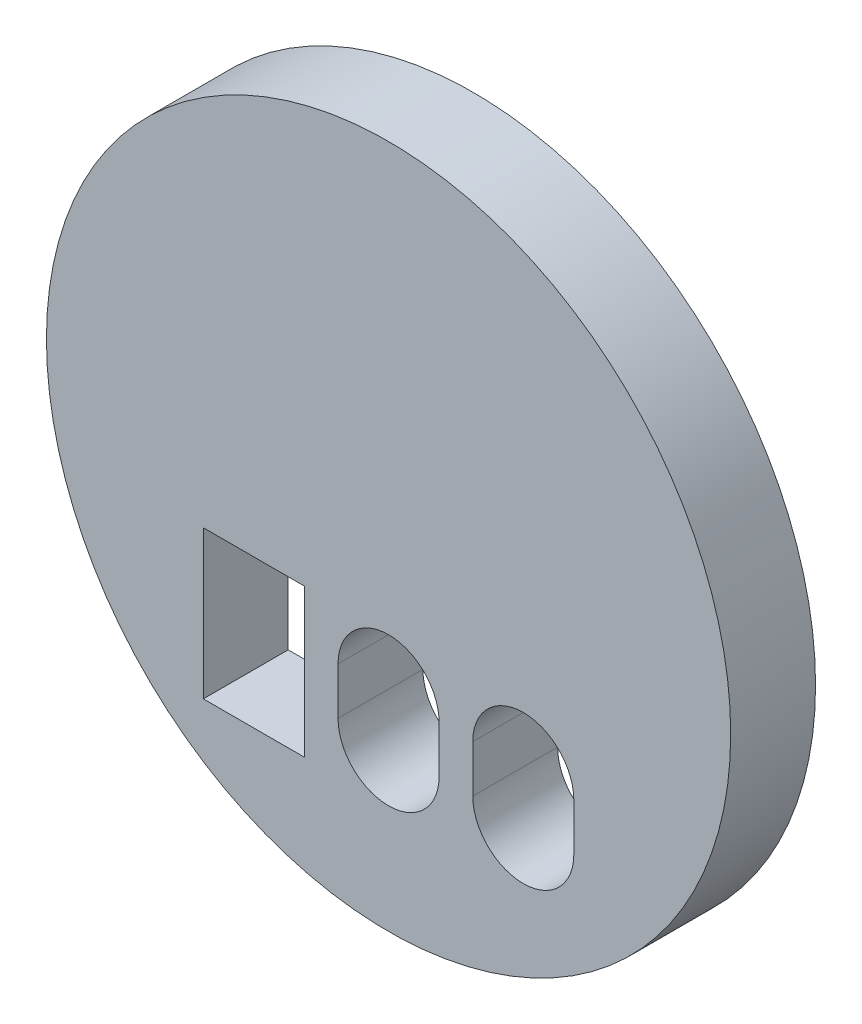
ISO-10303-21;
HEADER;
FILE_DESCRIPTION(('STEP AP214'),'2;1');
FILE_NAME('part.step','',(''),(''),'','','');
FILE_SCHEMA(('AUTOMOTIVE_DESIGN { 1 0 10303 214 1 1 1 1 }'));
ENDSEC;
DATA;
#1=APPLICATION_CONTEXT('core data for automotive mechanical design processes');
#2=APPLICATION_PROTOCOL_DEFINITION('international standard','automotive_design',2000,#1);
#3=PRODUCT_CONTEXT('',#1,'mechanical');
#4=PRODUCT('Part','Part','',(#3));
#5=PRODUCT_RELATED_PRODUCT_CATEGORY('part','',(#4));
#6=PRODUCT_DEFINITION_FORMATION('','',#4);
#7=PRODUCT_DEFINITION_CONTEXT('part definition',#1,'design');
#8=PRODUCT_DEFINITION('design','',#6,#7);
#9=PRODUCT_DEFINITION_SHAPE('','',#8);
#10=(LENGTH_UNIT() NAMED_UNIT(*) SI_UNIT(.MILLI.,.METRE.));
#11=(NAMED_UNIT(*) PLANE_ANGLE_UNIT() SI_UNIT($,.RADIAN.));
#12=(NAMED_UNIT(*) SI_UNIT($,.STERADIAN.) SOLID_ANGLE_UNIT());
#13=UNCERTAINTY_MEASURE_WITH_UNIT(LENGTH_MEASURE(1.E-05),#10,'distance_accuracy_value','');
#14=(GEOMETRIC_REPRESENTATION_CONTEXT(3) GLOBAL_UNCERTAINTY_ASSIGNED_CONTEXT((#13)) GLOBAL_UNIT_ASSIGNED_CONTEXT((#10,
#11,#12)) REPRESENTATION_CONTEXT('',''));
#15=CARTESIAN_POINT('',(0.,0.,0.));
#16=DIRECTION('',(0.,0.,1.));
#17=DIRECTION('',(1.,0.,0.));
#18=AXIS2_PLACEMENT_3D('',#15,#16,#17);
#19=CARTESIAN_POINT('',(0.,0.,1.6));
#20=DIRECTION('',(0.,0.,1.));
#21=DIRECTION('',(1.,0.,0.));
#22=AXIS2_PLACEMENT_3D('',#19,#20,#21);
#23=PLANE('',#22);
#24=CARTESIAN_POINT('',(0.,0.,1.6));
#25=DIRECTION('',(0.,0.,1.));
#26=DIRECTION('',(1.,0.,0.));
#27=AXIS2_PLACEMENT_3D('',#24,#25,#26);
#28=CIRCLE('',#27,6.45);
#29=CARTESIAN_POINT('',(6.45,0.,1.6));
#30=VERTEX_POINT('',#29);
#31=EDGE_CURVE('E11',#30,#30,#28,.T.);
#32=ORIENTED_EDGE('',*,*,#31,.T.);
#33=EDGE_LOOP('',(#32));
#34=FACE_BOUND('',#33,.T.);
#35=DIRECTION('',(0.,1.,0.));
#36=VECTOR('',#35,1.);
#37=CARTESIAN_POINT('',(0.9525,-2.5555,1.6));
#38=LINE('',#37,#36);
#39=CARTESIAN_POINT('',(0.9525,-3.4445,1.6));
#40=VERTEX_POINT('',#39);
#41=CARTESIAN_POINT('',(0.9525,-2.5555,1.6));
#42=VERTEX_POINT('',#41);
#43=EDGE_CURVE('E190',#40,#42,#38,.T.);
#44=ORIENTED_EDGE('',*,*,#43,.F.);
#45=CARTESIAN_POINT('',(0.,-3.4445,1.6));
#46=DIRECTION('',(0.,0.,1.));
#47=DIRECTION('',(1.,0.,0.));
#48=AXIS2_PLACEMENT_3D('',#45,#46,#47);
#49=CIRCLE('',#48,0.9525);
#50=CARTESIAN_POINT('',(-0.9525,-3.4445,1.6));
#51=VERTEX_POINT('',#50);
#52=EDGE_CURVE('E188',#51,#40,#49,.T.);
#53=ORIENTED_EDGE('',*,*,#52,.F.);
#54=DIRECTION('',(0.,-1.,0.));
#55=VECTOR('',#54,1.);
#56=CARTESIAN_POINT('',(-0.9525,-3.4445,1.6));
#57=LINE('',#56,#55);
#58=CARTESIAN_POINT('',(-0.9525,-2.5555,1.6));
#59=VERTEX_POINT('',#58);
#60=EDGE_CURVE('E196',#59,#51,#57,.T.);
#61=ORIENTED_EDGE('',*,*,#60,.F.);
#62=CARTESIAN_POINT('',(0.,-2.5555,1.6));
#63=DIRECTION('',(0.,0.,1.));
#64=DIRECTION('',(1.,0.,0.));
#65=AXIS2_PLACEMENT_3D('',#62,#63,#64);
#66=CIRCLE('',#65,0.9525);
#67=EDGE_CURVE('E193',#42,#59,#66,.T.);
#68=ORIENTED_EDGE('',*,*,#67,.F.);
#69=EDGE_LOOP('',(#44,#53,#61,#68));
#70=FACE_BOUND('',#69,.T.);
#71=DIRECTION('',(0.,1.,0.));
#72=VECTOR('',#71,1.);
#73=CARTESIAN_POINT('',(3.4925,-2.5555,1.6));
#74=LINE('',#73,#72);
#75=CARTESIAN_POINT('',(3.4925,-3.4445,1.6));
#76=VERTEX_POINT('',#75);
#77=CARTESIAN_POINT('',(3.4925,-2.5555,1.6));
#78=VERTEX_POINT('',#77);
#79=EDGE_CURVE('E159',#76,#78,#74,.T.);
#80=ORIENTED_EDGE('',*,*,#79,.F.);
#81=CARTESIAN_POINT('',(2.54,-3.4445,1.6));
#82=DIRECTION('',(0.,0.,1.));
#83=DIRECTION('',(1.,0.,0.));
#84=AXIS2_PLACEMENT_3D('',#81,#82,#83);
#85=CIRCLE('',#84,0.9525);
#86=CARTESIAN_POINT('',(1.5875,-3.4445,1.6));
#87=VERTEX_POINT('',#86);
#88=EDGE_CURVE('E157',#87,#76,#85,.T.);
#89=ORIENTED_EDGE('',*,*,#88,.F.);
#90=DIRECTION('',(0.,-1.,0.));
#91=VECTOR('',#90,1.);
#92=CARTESIAN_POINT('',(1.5875,-3.4445,1.6));
#93=LINE('',#92,#91);
#94=CARTESIAN_POINT('',(1.5875,-2.5555,1.6));
#95=VERTEX_POINT('',#94);
#96=EDGE_CURVE('E165',#95,#87,#93,.T.);
#97=ORIENTED_EDGE('',*,*,#96,.F.);
#98=CARTESIAN_POINT('',(2.54,-2.5555,1.6));
#99=DIRECTION('',(0.,0.,1.));
#100=DIRECTION('',(1.,0.,0.));
#101=AXIS2_PLACEMENT_3D('',#98,#99,#100);
#102=CIRCLE('',#101,0.9525);
#103=EDGE_CURVE('E162',#78,#95,#102,.T.);
#104=ORIENTED_EDGE('',*,*,#103,.F.);
#105=EDGE_LOOP('',(#80,#89,#97,#104));
#106=FACE_BOUND('',#105,.T.);
#107=DIRECTION('',(0.,1.,0.));
#108=VECTOR('',#107,1.);
#109=CARTESIAN_POINT('',(-1.5875,-1.603,1.6));
#110=LINE('',#109,#108);
#111=CARTESIAN_POINT('',(-1.5875,-4.397,1.6));
#112=VERTEX_POINT('',#111);
#113=CARTESIAN_POINT('',(-1.5875,-1.603,1.6));
#114=VERTEX_POINT('',#113);
#115=EDGE_CURVE('E129',#112,#114,#110,.T.);
#116=ORIENTED_EDGE('',*,*,#115,.F.);
#117=DIRECTION('',(1.,0.,0.));
#118=VECTOR('',#117,1.);
#119=CARTESIAN_POINT('',(-1.5875,-4.397,1.6));
#120=LINE('',#119,#118);
#121=CARTESIAN_POINT('',(-3.4925,-4.397,1.6));
#122=VERTEX_POINT('',#121);
#123=EDGE_CURVE('E121',#122,#112,#120,.T.);
#124=ORIENTED_EDGE('',*,*,#123,.F.);
#125=DIRECTION('',(0.,-1.,0.));
#126=VECTOR('',#125,1.);
#127=CARTESIAN_POINT('',(-3.4925,-4.397,1.6));
#128=LINE('',#127,#126);
#129=CARTESIAN_POINT('',(-3.4925,-1.603,1.6));
#130=VERTEX_POINT('',#129);
#131=EDGE_CURVE('E143',#130,#122,#128,.T.);
#132=ORIENTED_EDGE('',*,*,#131,.F.);
#133=DIRECTION('',(-1.,0.,0.));
#134=VECTOR('',#133,1.);
#135=CARTESIAN_POINT('',(-3.4925,-1.603,1.6));
#136=LINE('',#135,#134);
#137=EDGE_CURVE('E141',#114,#130,#136,.T.);
#138=ORIENTED_EDGE('',*,*,#137,.F.);
#139=EDGE_LOOP('',(#116,#124,#132,#138));
#140=FACE_BOUND('',#139,.T.);
#141=ADVANCED_FACE('F32',(#34,#70,#106,#140),#23,.T.);
#142=CARTESIAN_POINT('',(0.,0.,0.));
#143=DIRECTION('',(0.,0.,1.));
#144=DIRECTION('',(1.,0.,0.));
#145=AXIS2_PLACEMENT_3D('',#142,#143,#144);
#146=PLANE('',#145);
#147=CARTESIAN_POINT('',(2.54,-3.4445,0.));
#148=DIRECTION('',(0.,0.,1.));
#149=DIRECTION('',(1.,0.,0.));
#150=AXIS2_PLACEMENT_3D('',#147,#148,#149);
#151=CIRCLE('',#150,0.9525);
#152=CARTESIAN_POINT('',(1.5875,-3.4445,0.));
#153=VERTEX_POINT('',#152);
#154=CARTESIAN_POINT('',(3.4925,-3.4445,0.));
#155=VERTEX_POINT('',#154);
#156=EDGE_CURVE('E137',#153,#155,#151,.T.);
#157=ORIENTED_EDGE('',*,*,#156,.T.);
#158=DIRECTION('',(0.,1.,0.));
#159=VECTOR('',#158,1.);
#160=CARTESIAN_POINT('',(3.4925,-2.5555,0.));
#161=LINE('',#160,#159);
#162=CARTESIAN_POINT('',(3.4925,-2.5555,0.));
#163=VERTEX_POINT('',#162);
#164=EDGE_CURVE('E170',#155,#163,#161,.T.);
#165=ORIENTED_EDGE('',*,*,#164,.T.);
#166=CARTESIAN_POINT('',(2.54,-2.5555,0.));
#167=DIRECTION('',(0.,0.,1.));
#168=DIRECTION('',(1.,0.,0.));
#169=AXIS2_PLACEMENT_3D('',#166,#167,#168);
#170=CIRCLE('',#169,0.9525);
#171=CARTESIAN_POINT('',(1.5875,-2.5555,0.));
#172=VERTEX_POINT('',#171);
#173=EDGE_CURVE('E173',#163,#172,#170,.T.);
#174=ORIENTED_EDGE('',*,*,#173,.T.);
#175=DIRECTION('',(0.,-1.,0.));
#176=VECTOR('',#175,1.);
#177=CARTESIAN_POINT('',(1.5875,-3.4445,0.));
#178=LINE('',#177,#176);
#179=EDGE_CURVE('E160',#172,#153,#178,.T.);
#180=ORIENTED_EDGE('',*,*,#179,.T.);
#181=EDGE_LOOP('',(#157,#165,#174,#180));
#182=FACE_BOUND('',#181,.T.);
#183=CARTESIAN_POINT('',(0.,0.,0.));
#184=DIRECTION('',(0.,0.,1.));
#185=DIRECTION('',(1.,0.,0.));
#186=AXIS2_PLACEMENT_3D('',#183,#184,#185);
#187=CIRCLE('',#186,6.45);
#188=CARTESIAN_POINT('',(6.45,0.,0.));
#189=VERTEX_POINT('',#188);
#190=EDGE_CURVE('E36',#189,#189,#187,.T.);
#191=ORIENTED_EDGE('',*,*,#190,.F.);
#192=EDGE_LOOP('',(#191));
#193=FACE_BOUND('',#192,.T.);
#194=CARTESIAN_POINT('',(0.,-3.4445,0.));
#195=DIRECTION('',(0.,0.,1.));
#196=DIRECTION('',(1.,0.,0.));
#197=AXIS2_PLACEMENT_3D('',#194,#195,#196);
#198=CIRCLE('',#197,0.9525);
#199=CARTESIAN_POINT('',(-0.9525,-3.4445,0.));
#200=VERTEX_POINT('',#199);
#201=CARTESIAN_POINT('',(0.9525,-3.4445,0.));
#202=VERTEX_POINT('',#201);
#203=EDGE_CURVE('E187',#200,#202,#198,.T.);
#204=ORIENTED_EDGE('',*,*,#203,.T.);
#205=DIRECTION('',(0.,1.,0.));
#206=VECTOR('',#205,1.);
#207=CARTESIAN_POINT('',(0.9525,-2.5555,0.));
#208=LINE('',#207,#206);
#209=CARTESIAN_POINT('',(0.9525,-2.5555,0.));
#210=VERTEX_POINT('',#209);
#211=EDGE_CURVE('E201',#202,#210,#208,.T.);
#212=ORIENTED_EDGE('',*,*,#211,.T.);
#213=CARTESIAN_POINT('',(0.,-2.5555,0.));
#214=DIRECTION('',(0.,0.,1.));
#215=DIRECTION('',(1.,0.,0.));
#216=AXIS2_PLACEMENT_3D('',#213,#214,#215);
#217=CIRCLE('',#216,0.9525);
#218=CARTESIAN_POINT('',(-0.9525,-2.5555,0.));
#219=VERTEX_POINT('',#218);
#220=EDGE_CURVE('E204',#210,#219,#217,.T.);
#221=ORIENTED_EDGE('',*,*,#220,.T.);
#222=DIRECTION('',(0.,-1.,0.));
#223=VECTOR('',#222,1.);
#224=CARTESIAN_POINT('',(-0.9525,-3.4445,0.));
#225=LINE('',#224,#223);
#226=EDGE_CURVE('E191',#219,#200,#225,.T.);
#227=ORIENTED_EDGE('',*,*,#226,.T.);
#228=EDGE_LOOP('',(#204,#212,#221,#227));
#229=FACE_BOUND('',#228,.T.);
#230=DIRECTION('',(1.,0.,0.));
#231=VECTOR('',#230,1.);
#232=CARTESIAN_POINT('',(-1.5875,-4.397,0.));
#233=LINE('',#232,#231);
#234=CARTESIAN_POINT('',(-3.4925,-4.397,0.));
#235=VERTEX_POINT('',#234);
#236=CARTESIAN_POINT('',(-1.5875,-4.397,0.));
#237=VERTEX_POINT('',#236);
#238=EDGE_CURVE('E55',#235,#237,#233,.T.);
#239=ORIENTED_EDGE('',*,*,#238,.T.);
#240=DIRECTION('',(0.,1.,0.));
#241=VECTOR('',#240,1.);
#242=CARTESIAN_POINT('',(-1.5875,-1.603,0.));
#243=LINE('',#242,#241);
#244=CARTESIAN_POINT('',(-1.5875,-1.603,0.));
#245=VERTEX_POINT('',#244);
#246=EDGE_CURVE('E136',#237,#245,#243,.T.);
#247=ORIENTED_EDGE('',*,*,#246,.T.);
#248=DIRECTION('',(-1.,0.,0.));
#249=VECTOR('',#248,1.);
#250=CARTESIAN_POINT('',(-3.4925,-1.603,0.));
#251=LINE('',#250,#249);
#252=CARTESIAN_POINT('',(-3.4925,-1.603,0.));
#253=VERTEX_POINT('',#252);
#254=EDGE_CURVE('E149',#245,#253,#251,.T.);
#255=ORIENTED_EDGE('',*,*,#254,.T.);
#256=DIRECTION('',(0.,-1.,0.));
#257=VECTOR('',#256,1.);
#258=CARTESIAN_POINT('',(-3.4925,-4.397,0.));
#259=LINE('',#258,#257);
#260=EDGE_CURVE('E130',#253,#235,#259,.T.);
#261=ORIENTED_EDGE('',*,*,#260,.T.);
#262=EDGE_LOOP('',(#239,#247,#255,#261));
#263=FACE_BOUND('',#262,.T.);
#264=ADVANCED_FACE('F223',(#182,#193,#229,#263),#146,.F.);
#265=CARTESIAN_POINT('',(0.,0.,1.6));
#266=DIRECTION('',(0.,0.,-1.));
#267=DIRECTION('',(-1.,0.,0.));
#268=AXIS2_PLACEMENT_3D('',#265,#266,#267);
#269=CYLINDRICAL_SURFACE('',#268,6.45);
#270=ORIENTED_EDGE('',*,*,#31,.F.);
#271=EDGE_LOOP('',(#270));
#272=FACE_BOUND('',#271,.T.);
#273=ORIENTED_EDGE('',*,*,#190,.T.);
#274=EDGE_LOOP('',(#273));
#275=FACE_BOUND('',#274,.T.);
#276=ADVANCED_FACE('F34',(#272,#275),#269,.T.);
#277=CARTESIAN_POINT('',(0.,-3.4445,1.6));
#278=DIRECTION('',(0.,0.,-1.));
#279=DIRECTION('',(-1.,0.,0.));
#280=AXIS2_PLACEMENT_3D('',#277,#278,#279);
#281=CYLINDRICAL_SURFACE('',#280,0.9525);
#282=ORIENTED_EDGE('',*,*,#203,.F.);
#283=DIRECTION('',(0.,0.,-1.));
#284=VECTOR('',#283,1.);
#285=CARTESIAN_POINT('',(-0.9525,-3.4445,1.6));
#286=LINE('',#285,#284);
#287=EDGE_CURVE('E198',#51,#200,#286,.T.);
#288=ORIENTED_EDGE('',*,*,#287,.F.);
#289=ORIENTED_EDGE('',*,*,#52,.T.);
#290=DIRECTION('',(0.,0.,-1.));
#291=VECTOR('',#290,1.);
#292=CARTESIAN_POINT('',(0.9525,-3.4445,1.6));
#293=LINE('',#292,#291);
#294=EDGE_CURVE('E215',#40,#202,#293,.T.);
#295=ORIENTED_EDGE('',*,*,#294,.T.);
#296=EDGE_LOOP('',(#282,#288,#289,#295));
#297=FACE_BOUND('',#296,.T.);
#298=ADVANCED_FACE('F245',(#297),#281,.F.);
#299=CARTESIAN_POINT('',(0.9525,-2.5555,1.6));
#300=DIRECTION('',(-1.,0.,0.));
#301=DIRECTION('',(0.,0.,1.));
#302=AXIS2_PLACEMENT_3D('',#299,#300,#301);
#303=PLANE('',#302);
#304=ORIENTED_EDGE('',*,*,#211,.F.);
#305=ORIENTED_EDGE('',*,*,#294,.F.);
#306=ORIENTED_EDGE('',*,*,#43,.T.);
#307=DIRECTION('',(0.,0.,-1.));
#308=VECTOR('',#307,1.);
#309=CARTESIAN_POINT('',(0.9525,-2.5555,1.6));
#310=LINE('',#309,#308);
#311=EDGE_CURVE('E213',#42,#210,#310,.T.);
#312=ORIENTED_EDGE('',*,*,#311,.T.);
#313=EDGE_LOOP('',(#304,#305,#306,#312));
#314=FACE_BOUND('',#313,.T.);
#315=ADVANCED_FACE('F248',(#314),#303,.T.);
#316=CARTESIAN_POINT('',(0.,-2.5555,1.6));
#317=DIRECTION('',(0.,0.,-1.));
#318=DIRECTION('',(-1.,0.,0.));
#319=AXIS2_PLACEMENT_3D('',#316,#317,#318);
#320=CYLINDRICAL_SURFACE('',#319,0.9525);
#321=ORIENTED_EDGE('',*,*,#220,.F.);
#322=ORIENTED_EDGE('',*,*,#311,.F.);
#323=ORIENTED_EDGE('',*,*,#67,.T.);
#324=DIRECTION('',(0.,0.,-1.));
#325=VECTOR('',#324,1.);
#326=CARTESIAN_POINT('',(-0.9525,-2.5555,1.6));
#327=LINE('',#326,#325);
#328=EDGE_CURVE('E211',#59,#219,#327,.T.);
#329=ORIENTED_EDGE('',*,*,#328,.T.);
#330=EDGE_LOOP('',(#321,#322,#323,#329));
#331=FACE_BOUND('',#330,.T.);
#332=ADVANCED_FACE('F251',(#331),#320,.F.);
#333=CARTESIAN_POINT('',(-0.9525,-3.4445,1.6));
#334=DIRECTION('',(1.,0.,0.));
#335=DIRECTION('',(0.,0.,-1.));
#336=AXIS2_PLACEMENT_3D('',#333,#334,#335);
#337=PLANE('',#336);
#338=ORIENTED_EDGE('',*,*,#226,.F.);
#339=ORIENTED_EDGE('',*,*,#328,.F.);
#340=ORIENTED_EDGE('',*,*,#60,.T.);
#341=ORIENTED_EDGE('',*,*,#287,.T.);
#342=EDGE_LOOP('',(#338,#339,#340,#341));
#343=FACE_BOUND('',#342,.T.);
#344=ADVANCED_FACE('F255',(#343),#337,.T.);
#345=CARTESIAN_POINT('',(2.54,-3.4445,1.6));
#346=DIRECTION('',(0.,0.,-1.));
#347=DIRECTION('',(-1.,0.,0.));
#348=AXIS2_PLACEMENT_3D('',#345,#346,#347);
#349=CYLINDRICAL_SURFACE('',#348,0.9525);
#350=ORIENTED_EDGE('',*,*,#156,.F.);
#351=DIRECTION('',(0.,0.,-1.));
#352=VECTOR('',#351,1.);
#353=CARTESIAN_POINT('',(1.5875,-3.4445,1.6));
#354=LINE('',#353,#352);
#355=EDGE_CURVE('E167',#87,#153,#354,.T.);
#356=ORIENTED_EDGE('',*,*,#355,.F.);
#357=ORIENTED_EDGE('',*,*,#88,.T.);
#358=DIRECTION('',(0.,0.,-1.));
#359=VECTOR('',#358,1.);
#360=CARTESIAN_POINT('',(3.4925,-3.4445,1.6));
#361=LINE('',#360,#359);
#362=EDGE_CURVE('E184',#76,#155,#361,.T.);
#363=ORIENTED_EDGE('',*,*,#362,.T.);
#364=EDGE_LOOP('',(#350,#356,#357,#363));
#365=FACE_BOUND('',#364,.T.);
#366=ADVANCED_FACE('F259',(#365),#349,.F.);
#367=CARTESIAN_POINT('',(3.4925,-2.5555,1.6));
#368=DIRECTION('',(-1.,0.,0.));
#369=DIRECTION('',(0.,0.,1.));
#370=AXIS2_PLACEMENT_3D('',#367,#368,#369);
#371=PLANE('',#370);
#372=ORIENTED_EDGE('',*,*,#164,.F.);
#373=ORIENTED_EDGE('',*,*,#362,.F.);
#374=ORIENTED_EDGE('',*,*,#79,.T.);
#375=DIRECTION('',(0.,0.,-1.));
#376=VECTOR('',#375,1.);
#377=CARTESIAN_POINT('',(3.4925,-2.5555,1.6));
#378=LINE('',#377,#376);
#379=EDGE_CURVE('E182',#78,#163,#378,.T.);
#380=ORIENTED_EDGE('',*,*,#379,.T.);
#381=EDGE_LOOP('',(#372,#373,#374,#380));
#382=FACE_BOUND('',#381,.T.);
#383=ADVANCED_FACE('F263',(#382),#371,.T.);
#384=CARTESIAN_POINT('',(2.54,-2.5555,1.6));
#385=DIRECTION('',(0.,0.,-1.));
#386=DIRECTION('',(-1.,0.,0.));
#387=AXIS2_PLACEMENT_3D('',#384,#385,#386);
#388=CYLINDRICAL_SURFACE('',#387,0.9525);
#389=ORIENTED_EDGE('',*,*,#173,.F.);
#390=ORIENTED_EDGE('',*,*,#379,.F.);
#391=ORIENTED_EDGE('',*,*,#103,.T.);
#392=DIRECTION('',(0.,0.,-1.));
#393=VECTOR('',#392,1.);
#394=CARTESIAN_POINT('',(1.5875,-2.5555,1.6));
#395=LINE('',#394,#393);
#396=EDGE_CURVE('E180',#95,#172,#395,.T.);
#397=ORIENTED_EDGE('',*,*,#396,.T.);
#398=EDGE_LOOP('',(#389,#390,#391,#397));
#399=FACE_BOUND('',#398,.T.);
#400=ADVANCED_FACE('F267',(#399),#388,.F.);
#401=CARTESIAN_POINT('',(1.5875,-3.4445,1.6));
#402=DIRECTION('',(1.,0.,0.));
#403=DIRECTION('',(0.,0.,-1.));
#404=AXIS2_PLACEMENT_3D('',#401,#402,#403);
#405=PLANE('',#404);
#406=ORIENTED_EDGE('',*,*,#179,.F.);
#407=ORIENTED_EDGE('',*,*,#396,.F.);
#408=ORIENTED_EDGE('',*,*,#96,.T.);
#409=ORIENTED_EDGE('',*,*,#355,.T.);
#410=EDGE_LOOP('',(#406,#407,#408,#409));
#411=FACE_BOUND('',#410,.T.);
#412=ADVANCED_FACE('F271',(#411),#405,.T.);
#413=CARTESIAN_POINT('',(-1.5875,-4.397,1.6));
#414=DIRECTION('',(0.,1.,0.));
#415=DIRECTION('',(0.,0.,1.));
#416=AXIS2_PLACEMENT_3D('',#413,#414,#415);
#417=PLANE('',#416);
#418=ORIENTED_EDGE('',*,*,#238,.F.);
#419=DIRECTION('',(0.,0.,-1.));
#420=VECTOR('',#419,1.);
#421=CARTESIAN_POINT('',(-3.4925,-4.397,1.6));
#422=LINE('',#421,#420);
#423=EDGE_CURVE('E125',#122,#235,#422,.T.);
#424=ORIENTED_EDGE('',*,*,#423,.F.);
#425=ORIENTED_EDGE('',*,*,#123,.T.);
#426=DIRECTION('',(0.,0.,-1.));
#427=VECTOR('',#426,1.);
#428=CARTESIAN_POINT('',(-1.5875,-4.397,1.6));
#429=LINE('',#428,#427);
#430=EDGE_CURVE('E124',#112,#237,#429,.T.);
#431=ORIENTED_EDGE('',*,*,#430,.T.);
#432=EDGE_LOOP('',(#418,#424,#425,#431));
#433=FACE_BOUND('',#432,.T.);
#434=ADVANCED_FACE('F123',(#433),#417,.T.);
#435=CARTESIAN_POINT('',(-1.5875,-1.603,1.6));
#436=DIRECTION('',(-1.,0.,0.));
#437=DIRECTION('',(0.,0.,1.));
#438=AXIS2_PLACEMENT_3D('',#435,#436,#437);
#439=PLANE('',#438);
#440=ORIENTED_EDGE('',*,*,#246,.F.);
#441=ORIENTED_EDGE('',*,*,#430,.F.);
#442=ORIENTED_EDGE('',*,*,#115,.T.);
#443=DIRECTION('',(0.,0.,-1.));
#444=VECTOR('',#443,1.);
#445=CARTESIAN_POINT('',(-1.5875,-1.603,1.6));
#446=LINE('',#445,#444);
#447=EDGE_CURVE('E138',#114,#245,#446,.T.);
#448=ORIENTED_EDGE('',*,*,#447,.T.);
#449=EDGE_LOOP('',(#440,#441,#442,#448));
#450=FACE_BOUND('',#449,.T.);
#451=ADVANCED_FACE('F133',(#450),#439,.T.);
#452=CARTESIAN_POINT('',(-3.4925,-1.603,1.6));
#453=DIRECTION('',(0.,-1.,0.));
#454=DIRECTION('',(0.,0.,-1.));
#455=AXIS2_PLACEMENT_3D('',#452,#453,#454);
#456=PLANE('',#455);
#457=ORIENTED_EDGE('',*,*,#254,.F.);
#458=ORIENTED_EDGE('',*,*,#447,.F.);
#459=ORIENTED_EDGE('',*,*,#137,.T.);
#460=DIRECTION('',(0.,0.,-1.));
#461=VECTOR('',#460,1.);
#462=CARTESIAN_POINT('',(-3.4925,-1.603,1.6));
#463=LINE('',#462,#461);
#464=EDGE_CURVE('E47',#130,#253,#463,.T.);
#465=ORIENTED_EDGE('',*,*,#464,.T.);
#466=EDGE_LOOP('',(#457,#458,#459,#465));
#467=FACE_BOUND('',#466,.T.);
#468=ADVANCED_FACE('F231',(#467),#456,.T.);
#469=CARTESIAN_POINT('',(-3.4925,-4.397,1.6));
#470=DIRECTION('',(1.,0.,0.));
#471=DIRECTION('',(0.,0.,-1.));
#472=AXIS2_PLACEMENT_3D('',#469,#470,#471);
#473=PLANE('',#472);
#474=ORIENTED_EDGE('',*,*,#260,.F.);
#475=ORIENTED_EDGE('',*,*,#464,.F.);
#476=ORIENTED_EDGE('',*,*,#131,.T.);
#477=ORIENTED_EDGE('',*,*,#423,.T.);
#478=EDGE_LOOP('',(#474,#475,#476,#477));
#479=FACE_BOUND('',#478,.T.);
#480=ADVANCED_FACE('F229',(#479),#473,.T.);
#481=CLOSED_SHELL('',(#141,#264,#276,#298,#315,#332,#344,#366,#383,#400,#412,#434,#451,#468,#480));
#482=MANIFOLD_SOLID_BREP('B2',#481);
#483=ADVANCED_BREP_SHAPE_REPRESENTATION('',(#18,#482),#14);
#484=SHAPE_DEFINITION_REPRESENTATION(#9,#483);
ENDSEC;
END-ISO-10303-21;
